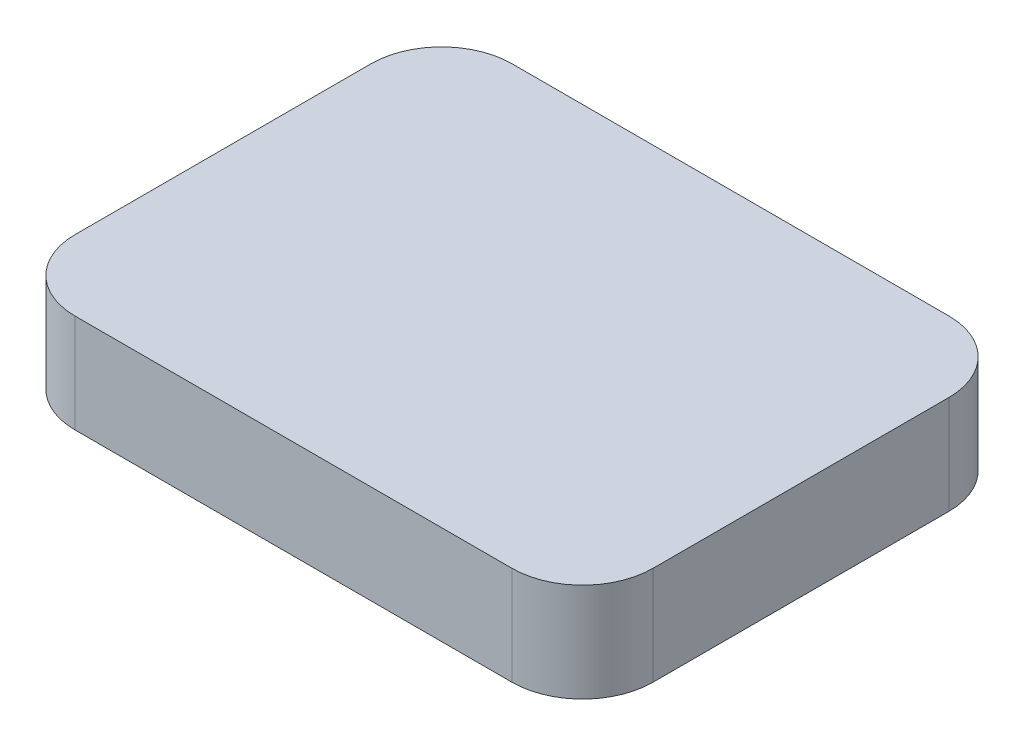
ISO-10303-21;
HEADER;
FILE_DESCRIPTION(('STEP AP214'),'2;1');
FILE_NAME('part.step','',(''),(''),'','','');
FILE_SCHEMA(('AUTOMOTIVE_DESIGN { 1 0 10303 214 1 1 1 1 }'));
ENDSEC;
DATA;
#1=APPLICATION_CONTEXT('core data for automotive mechanical design processes');
#2=APPLICATION_PROTOCOL_DEFINITION('international standard','automotive_design',2000,#1);
#3=PRODUCT_CONTEXT('',#1,'mechanical');
#4=PRODUCT('Part','Part','',(#3));
#5=PRODUCT_RELATED_PRODUCT_CATEGORY('part','',(#4));
#6=PRODUCT_DEFINITION_FORMATION('','',#4);
#7=PRODUCT_DEFINITION_CONTEXT('part definition',#1,'design');
#8=PRODUCT_DEFINITION('design','',#6,#7);
#9=PRODUCT_DEFINITION_SHAPE('','',#8);
#10=(LENGTH_UNIT() NAMED_UNIT(*) SI_UNIT(.MILLI.,.METRE.));
#11=(NAMED_UNIT(*) PLANE_ANGLE_UNIT() SI_UNIT($,.RADIAN.));
#12=(NAMED_UNIT(*) SI_UNIT($,.STERADIAN.) SOLID_ANGLE_UNIT());
#13=UNCERTAINTY_MEASURE_WITH_UNIT(LENGTH_MEASURE(1.E-05),#10,'distance_accuracy_value','');
#14=(GEOMETRIC_REPRESENTATION_CONTEXT(3) GLOBAL_UNCERTAINTY_ASSIGNED_CONTEXT((#13)) GLOBAL_UNIT_ASSIGNED_CONTEXT((#10,
#11,#12)) REPRESENTATION_CONTEXT('',''));
#15=CARTESIAN_POINT('',(0.,0.,0.));
#16=DIRECTION('',(0.,0.,1.));
#17=DIRECTION('',(1.,0.,0.));
#18=AXIS2_PLACEMENT_3D('',#15,#16,#17);
#19=CARTESIAN_POINT('',(0.,0.,0.));
#20=DIRECTION('',(0.,1.,0.));
#21=DIRECTION('',(0.,0.,1.));
#22=AXIS2_PLACEMENT_3D('',#19,#20,#21);
#23=PLANE('',#22);
#24=DIRECTION('',(1.,0.,0.));
#25=VECTOR('',#24,1.);
#26=CARTESIAN_POINT('',(0.,0.,-16.0429184549356));
#27=LINE('',#26,#25);
#28=CARTESIAN_POINT('',(-19.1587982832618,0.,-16.0429184549356));
#29=VERTEX_POINT('',#28);
#30=CARTESIAN_POINT('',(11.8412017167381,0.,-16.0429184549356));
#31=VERTEX_POINT('',#30);
#32=EDGE_CURVE('E147',#29,#31,#27,.T.);
#33=ORIENTED_EDGE('',*,*,#32,.T.);
#34=CARTESIAN_POINT('',(11.8412017167382,0.,-11.0429184549356));
#35=DIRECTION('',(0.,1.,0.));
#36=DIRECTION('',(0.,0.,1.));
#37=AXIS2_PLACEMENT_3D('',#34,#35,#36);
#38=CIRCLE('',#37,5.);
#39=CARTESIAN_POINT('',(16.8412017167382,0.,-11.0429184549356));
#40=VERTEX_POINT('',#39);
#41=EDGE_CURVE('E170',#31,#40,#38,.F.);
#42=ORIENTED_EDGE('',*,*,#41,.T.);
#43=DIRECTION('',(0.,0.,1.));
#44=VECTOR('',#43,1.);
#45=CARTESIAN_POINT('',(16.8412017167382,0.,0.));
#46=LINE('',#45,#44);
#47=CARTESIAN_POINT('',(16.8412017167382,0.,9.95708154506434));
#48=VERTEX_POINT('',#47);
#49=EDGE_CURVE('E164',#40,#48,#46,.T.);
#50=ORIENTED_EDGE('',*,*,#49,.T.);
#51=CARTESIAN_POINT('',(11.8412017167382,0.,9.95708154506438));
#52=DIRECTION('',(0.,1.,0.));
#53=DIRECTION('',(0.,0.,1.));
#54=AXIS2_PLACEMENT_3D('',#51,#52,#53);
#55=CIRCLE('',#54,5.);
#56=CARTESIAN_POINT('',(11.8412017167382,0.,14.9570815450644));
#57=VERTEX_POINT('',#56);
#58=EDGE_CURVE('E124',#48,#57,#55,.F.);
#59=ORIENTED_EDGE('',*,*,#58,.T.);
#60=DIRECTION('',(1.,0.,0.));
#61=VECTOR('',#60,1.);
#62=CARTESIAN_POINT('',(0.,0.,14.9570815450644));
#63=LINE('',#62,#61);
#64=CARTESIAN_POINT('',(-19.1587982832618,0.,14.9570815450644));
#65=VERTEX_POINT('',#64);
#66=EDGE_CURVE('E161',#65,#57,#63,.T.);
#67=ORIENTED_EDGE('',*,*,#66,.F.);
#68=CARTESIAN_POINT('',(-19.1587982832618,0.,9.95708154506438));
#69=DIRECTION('',(0.,1.,0.));
#70=DIRECTION('',(0.,0.,1.));
#71=AXIS2_PLACEMENT_3D('',#68,#69,#70);
#72=CIRCLE('',#71,5.);
#73=CARTESIAN_POINT('',(-24.1587982832618,0.,9.95708154506434));
#74=VERTEX_POINT('',#73);
#75=EDGE_CURVE('E158',#65,#74,#72,.F.);
#76=ORIENTED_EDGE('',*,*,#75,.T.);
#77=DIRECTION('',(0.,0.,1.));
#78=VECTOR('',#77,1.);
#79=CARTESIAN_POINT('',(-24.1587982832618,0.,0.));
#80=LINE('',#79,#78);
#81=CARTESIAN_POINT('',(-24.1587982832618,0.,-11.0429184549356));
#82=VERTEX_POINT('',#81);
#83=EDGE_CURVE('E154',#82,#74,#80,.T.);
#84=ORIENTED_EDGE('',*,*,#83,.F.);
#85=CARTESIAN_POINT('',(-19.1587982832618,0.,-11.0429184549356));
#86=DIRECTION('',(0.,1.,0.));
#87=DIRECTION('',(0.,0.,1.));
#88=AXIS2_PLACEMENT_3D('',#85,#86,#87);
#89=CIRCLE('',#88,5.);
#90=EDGE_CURVE('E155',#29,#82,#89,.T.);
#91=ORIENTED_EDGE('',*,*,#90,.F.);
#92=EDGE_LOOP('',(#33,#42,#50,#59,#67,#76,#84,#91));
#93=FACE_BOUND('',#92,.T.);
#94=DIRECTION('',(1.,0.,0.));
#95=VECTOR('',#94,1.);
#96=CARTESIAN_POINT('',(0.,0.,-11.0429184549356));
#97=LINE('',#96,#95);
#98=CARTESIAN_POINT('',(-19.1587982832618,0.,-11.0429184549356));
#99=VERTEX_POINT('',#98);
#100=CARTESIAN_POINT('',(11.8412017167382,0.,-11.0429184549356));
#101=VERTEX_POINT('',#100);
#102=EDGE_CURVE('E11',#99,#101,#97,.T.);
#103=ORIENTED_EDGE('',*,*,#102,.F.);
#104=DIRECTION('',(0.,0.,-1.));
#105=VECTOR('',#104,1.);
#106=CARTESIAN_POINT('',(-19.1587982832618,0.,0.));
#107=LINE('',#106,#105);
#108=CARTESIAN_POINT('',(-19.1587982832618,0.,9.95708154506437));
#109=VERTEX_POINT('',#108);
#110=EDGE_CURVE('E185',#109,#99,#107,.T.);
#111=ORIENTED_EDGE('',*,*,#110,.F.);
#112=DIRECTION('',(1.,0.,0.));
#113=VECTOR('',#112,1.);
#114=CARTESIAN_POINT('',(0.,0.,9.95708154506437));
#115=LINE('',#114,#113);
#116=CARTESIAN_POINT('',(11.8412017167382,0.,9.95708154506437));
#117=VERTEX_POINT('',#116);
#118=EDGE_CURVE('E184',#109,#117,#115,.T.);
#119=ORIENTED_EDGE('',*,*,#118,.T.);
#120=DIRECTION('',(0.,0.,-1.));
#121=VECTOR('',#120,1.);
#122=CARTESIAN_POINT('',(11.8412017167382,0.,0.));
#123=LINE('',#122,#121);
#124=EDGE_CURVE('E47',#117,#101,#123,.T.);
#125=ORIENTED_EDGE('',*,*,#124,.T.);
#126=EDGE_LOOP('',(#103,#111,#119,#125));
#127=FACE_BOUND('',#126,.T.);
#128=ADVANCED_FACE('F41',(#93,#127),#23,.F.);
#129=CARTESIAN_POINT('',(0.,7.,-16.0429184549356));
#130=DIRECTION('',(0.,0.,-1.));
#131=DIRECTION('',(-1.,0.,0.));
#132=AXIS2_PLACEMENT_3D('',#129,#130,#131);
#133=PLANE('',#132);
#134=ORIENTED_EDGE('',*,*,#32,.F.);
#135=DIRECTION('',(0.,-1.,0.));
#136=VECTOR('',#135,1.);
#137=CARTESIAN_POINT('',(-19.1587982832618,7.,-16.0429184549356));
#138=LINE('',#137,#136);
#139=CARTESIAN_POINT('',(-19.1587982832618,7.,-16.0429184549356));
#140=VERTEX_POINT('',#139);
#141=EDGE_CURVE('E101',#140,#29,#138,.T.);
#142=ORIENTED_EDGE('',*,*,#141,.F.);
#143=DIRECTION('',(1.,0.,0.));
#144=VECTOR('',#143,1.);
#145=CARTESIAN_POINT('',(0.,7.,-16.0429184549356));
#146=LINE('',#145,#144);
#147=CARTESIAN_POINT('',(11.8412017167381,7.,-16.0429184549356));
#148=VERTEX_POINT('',#147);
#149=EDGE_CURVE('E168',#140,#148,#146,.T.);
#150=ORIENTED_EDGE('',*,*,#149,.T.);
#151=DIRECTION('',(0.,-1.,0.));
#152=VECTOR('',#151,1.);
#153=CARTESIAN_POINT('',(11.8412017167381,7.,-16.0429184549356));
#154=LINE('',#153,#152);
#155=EDGE_CURVE('E63',#148,#31,#154,.T.);
#156=ORIENTED_EDGE('',*,*,#155,.T.);
#157=EDGE_LOOP('',(#134,#142,#150,#156));
#158=FACE_BOUND('',#157,.T.);
#159=ADVANCED_FACE('F43',(#158),#133,.T.);
#160=CARTESIAN_POINT('',(-19.1587982832618,7.,-11.0429184549356));
#161=DIRECTION('',(0.,-1.,0.));
#162=DIRECTION('',(0.,0.,-1.));
#163=AXIS2_PLACEMENT_3D('',#160,#161,#162);
#164=CYLINDRICAL_SURFACE('',#163,5.);
#165=ORIENTED_EDGE('',*,*,#90,.T.);
#166=DIRECTION('',(0.,-1.,0.));
#167=VECTOR('',#166,1.);
#168=CARTESIAN_POINT('',(-24.1587982832618,7.,-11.0429184549356));
#169=LINE('',#168,#167);
#170=CARTESIAN_POINT('',(-24.1587982832618,7.,-11.0429184549356));
#171=VERTEX_POINT('',#170);
#172=EDGE_CURVE('E178',#171,#82,#169,.T.);
#173=ORIENTED_EDGE('',*,*,#172,.F.);
#174=CARTESIAN_POINT('',(-19.1587982832618,7.,-11.0429184549356));
#175=DIRECTION('',(0.,1.,0.));
#176=DIRECTION('',(0.,0.,1.));
#177=AXIS2_PLACEMENT_3D('',#174,#175,#176);
#178=CIRCLE('',#177,5.);
#179=EDGE_CURVE('E214',#140,#171,#178,.T.);
#180=ORIENTED_EDGE('',*,*,#179,.F.);
#181=ORIENTED_EDGE('',*,*,#141,.T.);
#182=EDGE_LOOP('',(#165,#173,#180,#181));
#183=FACE_BOUND('',#182,.T.);
#184=ADVANCED_FACE('F249',(#183),#164,.T.);
#185=CARTESIAN_POINT('',(-24.1587982832618,7.,0.));
#186=DIRECTION('',(1.,0.,0.));
#187=DIRECTION('',(0.,0.,-1.));
#188=AXIS2_PLACEMENT_3D('',#185,#186,#187);
#189=PLANE('',#188);
#190=ORIENTED_EDGE('',*,*,#83,.T.);
#191=DIRECTION('',(0.,-1.,0.));
#192=VECTOR('',#191,1.);
#193=CARTESIAN_POINT('',(-24.1587982832618,7.,9.95708154506434));
#194=LINE('',#193,#192);
#195=CARTESIAN_POINT('',(-24.1587982832618,7.,9.95708154506434));
#196=VERTEX_POINT('',#195);
#197=EDGE_CURVE('E176',#196,#74,#194,.T.);
#198=ORIENTED_EDGE('',*,*,#197,.F.);
#199=DIRECTION('',(0.,0.,1.));
#200=VECTOR('',#199,1.);
#201=CARTESIAN_POINT('',(-24.1587982832618,7.,0.));
#202=LINE('',#201,#200);
#203=EDGE_CURVE('E220',#171,#196,#202,.T.);
#204=ORIENTED_EDGE('',*,*,#203,.F.);
#205=ORIENTED_EDGE('',*,*,#172,.T.);
#206=EDGE_LOOP('',(#190,#198,#204,#205));
#207=FACE_BOUND('',#206,.T.);
#208=ADVANCED_FACE('F229',(#207),#189,.F.);
#209=CARTESIAN_POINT('',(-19.1587982832618,7.,9.95708154506438));
#210=DIRECTION('',(0.,-1.,0.));
#211=DIRECTION('',(0.,0.,-1.));
#212=AXIS2_PLACEMENT_3D('',#209,#210,#211);
#213=CYLINDRICAL_SURFACE('',#212,5.);
#214=ORIENTED_EDGE('',*,*,#75,.F.);
#215=DIRECTION('',(0.,-1.,0.));
#216=VECTOR('',#215,1.);
#217=CARTESIAN_POINT('',(-19.1587982832618,7.,14.9570815450644));
#218=LINE('',#217,#216);
#219=CARTESIAN_POINT('',(-19.1587982832618,7.,14.9570815450644));
#220=VERTEX_POINT('',#219);
#221=EDGE_CURVE('E171',#220,#65,#218,.T.);
#222=ORIENTED_EDGE('',*,*,#221,.F.);
#223=CARTESIAN_POINT('',(-19.1587982832618,7.,9.95708154506438));
#224=DIRECTION('',(0.,1.,0.));
#225=DIRECTION('',(0.,0.,1.));
#226=AXIS2_PLACEMENT_3D('',#223,#224,#225);
#227=CIRCLE('',#226,5.);
#228=EDGE_CURVE('E218',#220,#196,#227,.F.);
#229=ORIENTED_EDGE('',*,*,#228,.T.);
#230=ORIENTED_EDGE('',*,*,#197,.T.);
#231=EDGE_LOOP('',(#214,#222,#229,#230));
#232=FACE_BOUND('',#231,.T.);
#233=ADVANCED_FACE('F224',(#232),#213,.T.);
#234=CARTESIAN_POINT('',(0.,7.,14.9570815450644));
#235=DIRECTION('',(0.,0.,-1.));
#236=DIRECTION('',(-1.,0.,0.));
#237=AXIS2_PLACEMENT_3D('',#234,#235,#236);
#238=PLANE('',#237);
#239=ORIENTED_EDGE('',*,*,#66,.T.);
#240=DIRECTION('',(0.,-1.,0.));
#241=VECTOR('',#240,1.);
#242=CARTESIAN_POINT('',(11.8412017167382,7.,14.9570815450644));
#243=LINE('',#242,#241);
#244=CARTESIAN_POINT('',(11.8412017167382,7.,14.9570815450644));
#245=VERTEX_POINT('',#244);
#246=EDGE_CURVE('E128',#245,#57,#243,.T.);
#247=ORIENTED_EDGE('',*,*,#246,.F.);
#248=DIRECTION('',(1.,0.,0.));
#249=VECTOR('',#248,1.);
#250=CARTESIAN_POINT('',(0.,7.,14.9570815450644));
#251=LINE('',#250,#249);
#252=EDGE_CURVE('E143',#220,#245,#251,.T.);
#253=ORIENTED_EDGE('',*,*,#252,.F.);
#254=ORIENTED_EDGE('',*,*,#221,.T.);
#255=EDGE_LOOP('',(#239,#247,#253,#254));
#256=FACE_BOUND('',#255,.T.);
#257=ADVANCED_FACE('F232',(#256),#238,.F.);
#258=CARTESIAN_POINT('',(11.8412017167382,7.,9.95708154506438));
#259=DIRECTION('',(0.,-1.,0.));
#260=DIRECTION('',(0.,0.,-1.));
#261=AXIS2_PLACEMENT_3D('',#258,#259,#260);
#262=CYLINDRICAL_SURFACE('',#261,5.);
#263=ORIENTED_EDGE('',*,*,#58,.F.);
#264=DIRECTION('',(0.,-1.,0.));
#265=VECTOR('',#264,1.);
#266=CARTESIAN_POINT('',(16.8412017167382,7.,9.95708154506434));
#267=LINE('',#266,#265);
#268=CARTESIAN_POINT('',(16.8412017167382,7.,9.95708154506434));
#269=VERTEX_POINT('',#268);
#270=EDGE_CURVE('E118',#269,#48,#267,.T.);
#271=ORIENTED_EDGE('',*,*,#270,.F.);
#272=CARTESIAN_POINT('',(11.8412017167382,7.,9.95708154506438));
#273=DIRECTION('',(0.,1.,0.));
#274=DIRECTION('',(0.,0.,1.));
#275=AXIS2_PLACEMENT_3D('',#272,#273,#274);
#276=CIRCLE('',#275,5.);
#277=EDGE_CURVE('E123',#269,#245,#276,.F.);
#278=ORIENTED_EDGE('',*,*,#277,.T.);
#279=ORIENTED_EDGE('',*,*,#246,.T.);
#280=EDGE_LOOP('',(#263,#271,#278,#279));
#281=FACE_BOUND('',#280,.T.);
#282=ADVANCED_FACE('F125',(#281),#262,.T.);
#283=CARTESIAN_POINT('',(16.8412017167382,7.,0.));
#284=DIRECTION('',(1.,0.,0.));
#285=DIRECTION('',(0.,0.,-1.));
#286=AXIS2_PLACEMENT_3D('',#283,#284,#285);
#287=PLANE('',#286);
#288=ORIENTED_EDGE('',*,*,#49,.F.);
#289=DIRECTION('',(0.,-1.,0.));
#290=VECTOR('',#289,1.);
#291=CARTESIAN_POINT('',(16.8412017167382,7.,-11.0429184549356));
#292=LINE('',#291,#290);
#293=CARTESIAN_POINT('',(16.8412017167382,7.,-11.0429184549356));
#294=VERTEX_POINT('',#293);
#295=EDGE_CURVE('E132',#294,#40,#292,.T.);
#296=ORIENTED_EDGE('',*,*,#295,.F.);
#297=DIRECTION('',(0.,0.,1.));
#298=VECTOR('',#297,1.);
#299=CARTESIAN_POINT('',(16.8412017167382,7.,0.));
#300=LINE('',#299,#298);
#301=EDGE_CURVE('E138',#294,#269,#300,.T.);
#302=ORIENTED_EDGE('',*,*,#301,.T.);
#303=ORIENTED_EDGE('',*,*,#270,.T.);
#304=EDGE_LOOP('',(#288,#296,#302,#303));
#305=FACE_BOUND('',#304,.T.);
#306=ADVANCED_FACE('F145',(#305),#287,.T.);
#307=CARTESIAN_POINT('',(11.8412017167382,7.,-11.0429184549356));
#308=DIRECTION('',(0.,-1.,0.));
#309=DIRECTION('',(0.,0.,-1.));
#310=AXIS2_PLACEMENT_3D('',#307,#308,#309);
#311=CYLINDRICAL_SURFACE('',#310,5.);
#312=ORIENTED_EDGE('',*,*,#41,.F.);
#313=ORIENTED_EDGE('',*,*,#155,.F.);
#314=CARTESIAN_POINT('',(11.8412017167382,7.,-11.0429184549356));
#315=DIRECTION('',(0.,1.,0.));
#316=DIRECTION('',(0.,0.,1.));
#317=AXIS2_PLACEMENT_3D('',#314,#315,#316);
#318=CIRCLE('',#317,5.);
#319=EDGE_CURVE('E144',#148,#294,#318,.F.);
#320=ORIENTED_EDGE('',*,*,#319,.T.);
#321=ORIENTED_EDGE('',*,*,#295,.T.);
#322=EDGE_LOOP('',(#312,#313,#320,#321));
#323=FACE_BOUND('',#322,.T.);
#324=ADVANCED_FACE('F255',(#323),#311,.T.);
#325=CARTESIAN_POINT('',(0.,7.,0.));
#326=DIRECTION('',(0.,1.,0.));
#327=DIRECTION('',(0.,0.,1.));
#328=AXIS2_PLACEMENT_3D('',#325,#326,#327);
#329=PLANE('',#328);
#330=ORIENTED_EDGE('',*,*,#149,.F.);
#331=ORIENTED_EDGE('',*,*,#179,.T.);
#332=ORIENTED_EDGE('',*,*,#203,.T.);
#333=ORIENTED_EDGE('',*,*,#228,.F.);
#334=ORIENTED_EDGE('',*,*,#252,.T.);
#335=ORIENTED_EDGE('',*,*,#277,.F.);
#336=ORIENTED_EDGE('',*,*,#301,.F.);
#337=ORIENTED_EDGE('',*,*,#319,.F.);
#338=EDGE_LOOP('',(#330,#331,#332,#333,#334,#335,#336,#337));
#339=FACE_BOUND('',#338,.T.);
#340=ADVANCED_FACE('F136',(#339),#329,.T.);
#341=CARTESIAN_POINT('',(-19.1587982832618,-4.,-11.0429184549356));
#342=DIRECTION('',(0.,0.,1.));
#343=DIRECTION('',(1.,0.,0.));
#344=AXIS2_PLACEMENT_3D('',#341,#342,#343);
#345=PLANE('',#344);
#346=ORIENTED_EDGE('',*,*,#102,.T.);
#347=DIRECTION('',(0.,1.,0.));
#348=VECTOR('',#347,1.);
#349=CARTESIAN_POINT('',(11.8412017167382,-4.,-11.0429184549356));
#350=LINE('',#349,#348);
#351=CARTESIAN_POINT('',(11.8412017167382,5.,-11.0429184549356));
#352=VERTEX_POINT('',#351);
#353=EDGE_CURVE('E153',#101,#352,#350,.T.);
#354=ORIENTED_EDGE('',*,*,#353,.T.);
#355=DIRECTION('',(1.,0.,0.));
#356=VECTOR('',#355,1.);
#357=CARTESIAN_POINT('',(-19.1587982832618,5.,-11.0429184549356));
#358=LINE('',#357,#356);
#359=CARTESIAN_POINT('',(-19.1587982832618,5.,-11.0429184549356));
#360=VERTEX_POINT('',#359);
#361=EDGE_CURVE('E330',#360,#352,#358,.T.);
#362=ORIENTED_EDGE('',*,*,#361,.F.);
#363=DIRECTION('',(0.,1.,0.));
#364=VECTOR('',#363,1.);
#365=CARTESIAN_POINT('',(-19.1587982832618,-4.,-11.0429184549356));
#366=LINE('',#365,#364);
#367=EDGE_CURVE('E209',#99,#360,#366,.T.);
#368=ORIENTED_EDGE('',*,*,#367,.F.);
#369=EDGE_LOOP('',(#346,#354,#362,#368));
#370=FACE_BOUND('',#369,.T.);
#371=ADVANCED_FACE('F275',(#370),#345,.T.);
#372=CARTESIAN_POINT('',(11.8412017167382,-4.,9.95708154506437));
#373=DIRECTION('',(1.,0.,0.));
#374=DIRECTION('',(0.,0.,-1.));
#375=AXIS2_PLACEMENT_3D('',#372,#373,#374);
#376=PLANE('',#375);
#377=DIRECTION('',(0.,1.,0.));
#378=VECTOR('',#377,1.);
#379=CARTESIAN_POINT('',(11.8412017167382,-4.,9.95708154506437));
#380=LINE('',#379,#378);
#381=CARTESIAN_POINT('',(11.8412017167382,5.,9.95708154506437));
#382=VERTEX_POINT('',#381);
#383=EDGE_CURVE('E199',#117,#382,#380,.T.);
#384=ORIENTED_EDGE('',*,*,#383,.T.);
#385=DIRECTION('',(0.,0.,-1.));
#386=VECTOR('',#385,1.);
#387=CARTESIAN_POINT('',(11.8412017167382,5.,9.95708154506437));
#388=LINE('',#387,#386);
#389=EDGE_CURVE('E327',#382,#352,#388,.T.);
#390=ORIENTED_EDGE('',*,*,#389,.T.);
#391=ORIENTED_EDGE('',*,*,#353,.F.);
#392=ORIENTED_EDGE('',*,*,#124,.F.);
#393=EDGE_LOOP('',(#384,#390,#391,#392));
#394=FACE_BOUND('',#393,.T.);
#395=ADVANCED_FACE('F197',(#394),#376,.F.);
#396=CARTESIAN_POINT('',(-19.1587982832618,-4.,9.95708154506437));
#397=DIRECTION('',(0.,0.,1.));
#398=DIRECTION('',(1.,0.,0.));
#399=AXIS2_PLACEMENT_3D('',#396,#397,#398);
#400=PLANE('',#399);
#401=DIRECTION('',(0.,1.,0.));
#402=VECTOR('',#401,1.);
#403=CARTESIAN_POINT('',(-19.1587982832618,-4.,9.95708154506437));
#404=LINE('',#403,#402);
#405=CARTESIAN_POINT('',(-19.1587982832618,5.,9.95708154506437));
#406=VERTEX_POINT('',#405);
#407=EDGE_CURVE('E57',#109,#406,#404,.T.);
#408=ORIENTED_EDGE('',*,*,#407,.T.);
#409=DIRECTION('',(1.,0.,0.));
#410=VECTOR('',#409,1.);
#411=CARTESIAN_POINT('',(-19.1587982832618,5.,9.95708154506437));
#412=LINE('',#411,#410);
#413=EDGE_CURVE('E206',#406,#382,#412,.T.);
#414=ORIENTED_EDGE('',*,*,#413,.T.);
#415=ORIENTED_EDGE('',*,*,#383,.F.);
#416=ORIENTED_EDGE('',*,*,#118,.F.);
#417=EDGE_LOOP('',(#408,#414,#415,#416));
#418=FACE_BOUND('',#417,.T.);
#419=ADVANCED_FACE('F204',(#418),#400,.F.);
#420=CARTESIAN_POINT('',(-19.1587982832618,-4.,9.95708154506437));
#421=DIRECTION('',(1.,0.,0.));
#422=DIRECTION('',(0.,0.,-1.));
#423=AXIS2_PLACEMENT_3D('',#420,#421,#422);
#424=PLANE('',#423);
#425=ORIENTED_EDGE('',*,*,#110,.T.);
#426=ORIENTED_EDGE('',*,*,#367,.T.);
#427=DIRECTION('',(0.,0.,-1.));
#428=VECTOR('',#427,1.);
#429=CARTESIAN_POINT('',(-19.1587982832618,5.,9.95708154506437));
#430=LINE('',#429,#428);
#431=EDGE_CURVE('E329',#406,#360,#430,.T.);
#432=ORIENTED_EDGE('',*,*,#431,.F.);
#433=ORIENTED_EDGE('',*,*,#407,.F.);
#434=EDGE_LOOP('',(#425,#426,#432,#433));
#435=FACE_BOUND('',#434,.T.);
#436=ADVANCED_FACE('F305',(#435),#424,.T.);
#437=CARTESIAN_POINT('',(0.,5.,0.));
#438=DIRECTION('',(0.,1.,0.));
#439=DIRECTION('',(0.,0.,1.));
#440=AXIS2_PLACEMENT_3D('',#437,#438,#439);
#441=PLANE('',#440);
#442=ORIENTED_EDGE('',*,*,#361,.T.);
#443=ORIENTED_EDGE('',*,*,#389,.F.);
#444=ORIENTED_EDGE('',*,*,#413,.F.);
#445=ORIENTED_EDGE('',*,*,#431,.T.);
#446=EDGE_LOOP('',(#442,#443,#444,#445));
#447=FACE_BOUND('',#446,.T.);
#448=ADVANCED_FACE('F313',(#447),#441,.F.);
#449=CLOSED_SHELL('',(#128,#159,#184,#208,#233,#257,#282,#306,#324,#340,#371,#395,#419,#436,#448));
#450=MANIFOLD_SOLID_BREP('B2',#449);
#451=ADVANCED_BREP_SHAPE_REPRESENTATION('',(#18,#450),#14);
#452=SHAPE_DEFINITION_REPRESENTATION(#9,#451);
ENDSEC;
END-ISO-10303-21;
